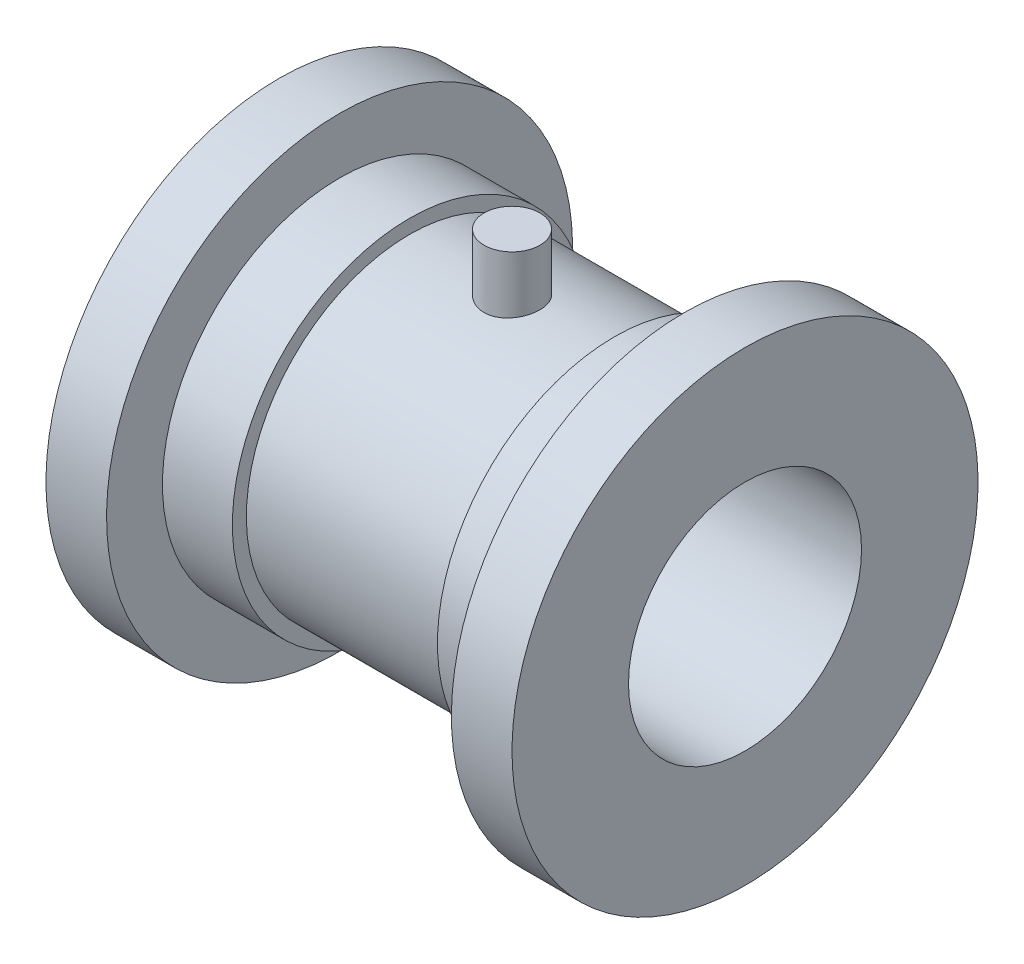
ISO-10303-21;
HEADER;
FILE_DESCRIPTION(('STEP AP214'),'2;1');
FILE_NAME('part.step','',(''),(''),'','','');
FILE_SCHEMA(('AUTOMOTIVE_DESIGN { 1 0 10303 214 1 1 1 1 }'));
ENDSEC;
DATA;
#1=APPLICATION_CONTEXT('core data for automotive mechanical design processes');
#2=APPLICATION_PROTOCOL_DEFINITION('international standard','automotive_design',2000,#1);
#3=PRODUCT_CONTEXT('',#1,'mechanical');
#4=PRODUCT('Part','Part','',(#3));
#5=PRODUCT_RELATED_PRODUCT_CATEGORY('part','',(#4));
#6=PRODUCT_DEFINITION_FORMATION('','',#4);
#7=PRODUCT_DEFINITION_CONTEXT('part definition',#1,'design');
#8=PRODUCT_DEFINITION('design','',#6,#7);
#9=PRODUCT_DEFINITION_SHAPE('','',#8);
#10=(LENGTH_UNIT() NAMED_UNIT(*) SI_UNIT(.MILLI.,.METRE.));
#11=(NAMED_UNIT(*) PLANE_ANGLE_UNIT() SI_UNIT($,.RADIAN.));
#12=(NAMED_UNIT(*) SI_UNIT($,.STERADIAN.) SOLID_ANGLE_UNIT());
#13=UNCERTAINTY_MEASURE_WITH_UNIT(LENGTH_MEASURE(1.E-05),#10,'distance_accuracy_value','');
#14=(GEOMETRIC_REPRESENTATION_CONTEXT(3) GLOBAL_UNCERTAINTY_ASSIGNED_CONTEXT((#13)) GLOBAL_UNIT_ASSIGNED_CONTEXT((#10,
#11,#12)) REPRESENTATION_CONTEXT('',''));
#15=CARTESIAN_POINT('',(0.,0.,0.));
#16=DIRECTION('',(0.,0.,1.));
#17=DIRECTION('',(1.,0.,0.));
#18=AXIS2_PLACEMENT_3D('',#15,#16,#17);
#19=CARTESIAN_POINT('',(25.,0.,0.));
#20=DIRECTION('',(1.,0.,0.));
#21=DIRECTION('',(0.,1.,0.));
#22=AXIS2_PLACEMENT_3D('',#19,#20,#21);
#23=CYLINDRICAL_SURFACE('',#22,17.5);
#24=CARTESIAN_POINT('',(0.,-17.3853386507137,2.));
#25=CARTESIAN_POINT('',(0.111946589372524,-17.3853401353315,1.99999519733595));
#26=CARTESIAN_POINT('',(0.223964994921923,-17.3864315751054,1.99056928251642));
#27=CARTESIAN_POINT('',(0.444889671697474,-17.3906782331753,1.95311344773096));
#28=CARTESIAN_POINT('',(0.553792479503965,-17.3938356616542,1.92506360351944));
#29=CARTESIAN_POINT('',(0.765255030279527,-17.4018520931882,1.85119296589626));
#30=CARTESIAN_POINT('',(0.867818819285594,-17.4067099973959,1.80538364660709));
#31=CARTESIAN_POINT('',(1.06378206604588,-17.4175786814491,1.6973178849601));
#32=CARTESIAN_POINT('',(1.15718320126785,-17.423589249671,1.6350644608687));
#33=CARTESIAN_POINT('',(1.33262956371172,-17.4361176819346,1.49556368835386));
#34=CARTESIAN_POINT('',(1.41462552791579,-17.4426375676046,1.41825455823809));
#35=CARTESIAN_POINT('',(1.56450902249383,-17.4554317583341,1.25096954824277));
#36=CARTESIAN_POINT('',(1.63239587710581,-17.4617060516193,1.16099306200071));
#37=CARTESIAN_POINT('',(1.75230824059131,-17.4733225280882,0.970620910263634));
#38=CARTESIAN_POINT('',(1.80428955803743,-17.4786620969871,0.870197236204717));
#39=CARTESIAN_POINT('',(1.89063240605875,-17.4877853680334,0.66197497320992));
#40=CARTESIAN_POINT('',(1.9249944880326,-17.4915691188697,0.554176615186415));
#41=CARTESIAN_POINT('',(1.97497734252851,-17.4971402074226,0.334766558288024));
#42=CARTESIAN_POINT('',(1.99067964857446,-17.4989362281041,0.223173657194599));
#43=CARTESIAN_POINT('',(2.00314972142082,-17.5003590938998,-0.00107691382555875));
#44=CARTESIAN_POINT('',(1.99991811760643,-17.4999860111176,-0.11373454823503));
#45=CARTESIAN_POINT('',(1.9746778272773,-17.497119767547,-0.33636248784968));
#46=CARTESIAN_POINT('',(1.95275682041612,-17.4946365066491,-0.44634287900327));
#47=CARTESIAN_POINT('',(1.89089682950376,-17.487840154992,-0.661053445479786));
#48=CARTESIAN_POINT('',(1.85095755129325,-17.4835270343592,-0.765783535057301));
#49=CARTESIAN_POINT('',(1.75410019097594,-17.4735386514763,-0.967294288035754));
#50=CARTESIAN_POINT('',(1.69714377600709,-17.4678603196472,-1.06405636819045));
#51=CARTESIAN_POINT('',(1.56789678444337,-17.4557776619181,-1.24668163917683));
#52=CARTESIAN_POINT('',(1.49560561983236,-17.449373308183,-1.33254441186903));
#53=CARTESIAN_POINT('',(1.33724919448781,-17.436513040988,-1.49144815236604));
#54=CARTESIAN_POINT('',(1.25110758210007,-17.4300570420279,-1.56441304576845));
#55=CARTESIAN_POINT('',(1.0677588923309,-17.4178574111694,-1.69485961446738));
#56=CARTESIAN_POINT('',(0.970551789715113,-17.4121137808956,-1.75234125445402));
#57=CARTESIAN_POINT('',(0.767767939743451,-17.4019890438088,-1.85019181534949));
#58=CARTESIAN_POINT('',(0.662188535919723,-17.3976083716403,-1.89055527879404));
#59=CARTESIAN_POINT('',(0.445689423466889,-17.3907142897617,-1.95295957446188));
#60=CARTESIAN_POINT('',(0.334769928945009,-17.3882008052541,-1.97500114064275));
#61=CARTESIAN_POINT('',(0.111409276007053,-17.3853390699854,-2.00003653434785));
#62=CARTESIAN_POINT('',(-0.00101976549901278,-17.384978682311,-2.00313713351255));
#63=CARTESIAN_POINT('',(-0.224795725911943,-17.3864318824203,-1.99048370024868));
#64=CARTESIAN_POINT('',(-0.336142663982754,-17.3882454316329,-1.97473000234356));
#65=CARTESIAN_POINT('',(-0.554277710431836,-17.3938311078367,-1.92490480743124));
#66=CARTESIAN_POINT('',(-0.661077653557208,-17.3975977651037,-1.89088445720912));
#67=CARTESIAN_POINT('',(-0.867456208856068,-17.4066608217964,-1.8055441206904));
#68=CARTESIAN_POINT('',(-0.96703460698983,-17.4119572665405,-1.75422362188829));
#69=CARTESIAN_POINT('',(-1.15662812006314,-17.4235123453982,-1.63547501760195));
#70=CARTESIAN_POINT('',(-1.24659891285623,-17.4297751382952,-1.56797655870491));
#71=CARTESIAN_POINT('',(-1.41397230825862,-17.442543959092,-1.41888814821184));
#72=CARTESIAN_POINT('',(-1.49137450327603,-17.4490499948718,-1.33729773979956));
#73=CARTESIAN_POINT('',(-1.63178548317454,-17.4616092377758,-1.16187651855541));
#74=CARTESIAN_POINT('',(-1.69472433770165,-17.4676601534551,-1.06798954470542));
#75=CARTESIAN_POINT('',(-1.80393937919363,-17.4785935486018,-0.870915351390362));
#76=CARTESIAN_POINT('',(-1.8502158540187,-17.4834760482544,-0.76772829263257));
#77=CARTESIAN_POINT('',(-1.92467566123988,-17.4915122431867,-0.55522073005071));
#78=CARTESIAN_POINT('',(-1.95290023506191,-17.4946698766728,-0.445914831710694));
#79=CARTESIAN_POINT('',(-1.99058941951927,-17.498916830849,-0.224077216219369));
#80=CARTESIAN_POINT('',(-2.00005473054384,-17.5000062287579,-0.111545619660739));
#81=CARTESIAN_POINT('',(-1.99994510250234,-17.4999937520126,0.112864401253133));
#82=CARTESIAN_POINT('',(-1.99047832045056,-17.4989043247502,0.224742894695049));
#83=CARTESIAN_POINT('',(-1.95300127134245,-17.4946812487719,0.445308378800854));
#84=CARTESIAN_POINT('',(-1.92499100344009,-17.4915475999627,0.553995369319134));
#85=CARTESIAN_POINT('',(-1.85125428527817,-17.4835868311737,0.765084431079245));
#86=CARTESIAN_POINT('',(-1.80553211653411,-17.478760120486,0.867488014290726));
#87=CARTESIAN_POINT('',(-1.69768073352085,-17.4679493137143,1.0631853726956));
#88=CARTESIAN_POINT('',(-1.63555145524283,-17.4619652131149,1.15647911234695));
#89=CARTESIAN_POINT('',(-1.49624648821104,-17.4494678477128,1.33186210611053));
#90=CARTESIAN_POINT('',(-1.41899021819487,-17.4429518630308,1.41388716420689));
#91=CARTESIAN_POINT('',(-1.25178901681435,-17.4301475365176,1.5638533009412));
#92=CARTESIAN_POINT('',(-1.16184106815131,-17.4238592492669,1.63179102096622));
#93=CARTESIAN_POINT('',(-0.971480376349264,-17.4122005213082,1.75183717616198));
#94=CARTESIAN_POINT('',(-0.871034600637649,-17.4068331273112,1.80389349456594));
#95=CARTESIAN_POINT('',(-0.662825662631923,-17.3976597913728,1.89032803888977));
#96=CARTESIAN_POINT('',(-0.555070743865214,-17.3938521233529,1.92472581745879));
#97=CARTESIAN_POINT('',(-0.372277873121076,-17.3891702575432,1.96647476380521));
#98=CARTESIAN_POINT('',(-0.298400454831266,-17.3877403947785,1.9790290620281));
#99=CARTESIAN_POINT('',(-0.149692726088288,-17.3858240977585,1.99579326119775));
#100=CARTESIAN_POINT('',(-0.0748624212969904,-17.3853376579002,2.00000321170177));
#101=CARTESIAN_POINT('',(0.,-17.3853386507137,2.));
#102=B_SPLINE_CURVE_WITH_KNOTS('',3,(#24,#25,#26,#27,#28,#29,#30,#31,#32,#33,#34,#35,#36,#37,
#38,#39,#40,#41,#42,#43,#44,#45,#46,#47,#48,#49,#50,#51,#52,#53,#54,#55,#56,#57,#58,#59,#60,#61,
#62,#63,#64,#65,#66,#67,#68,#69,#70,#71,#72,#73,#74,#75,#76,#77,#78,#79,#80,#81,#82,#83,#84,#85,
#86,#87,#88,#89,#90,#91,#92,#93,#94,#95,#96,#97,#98,#99,#100,#101),.UNSPECIFIED.,.T.,.F.,(4,2,2,
2,2,2,2,2,2,2,2,2,2,2,2,2,2,2,2,2,2,2,2,2,2,2,2,2,2,2,2,2,2,2,2,2,2,2,4),(0.,0.335566330669862,
0.671492236482426,1.00720146648589,1.34284912082551,1.67990430025881,2.01697561937898,
2.35497511648652,2.69296403516427,3.02947062308711,3.36596602520247,3.70089142156129,
4.03582228598058,4.3715133792636,4.70721734706225,5.04483970261994,5.3824628281258,
5.72019351085555,6.05791066376697,6.39372230997641,6.72952799811684,7.06439829362762,
7.3992785103225,7.73564232927687,8.07201705412561,8.40998545131677,8.74794800946722,
9.08513567305446,9.42231074728433,9.75756507912587,10.0928194262631,10.4279927825517,
10.7631674464669,11.1001786972192,11.4372702038874,11.7754563049136,12.113267132881,
12.3376728727777,12.5620772799195),.UNSPECIFIED.);
#103=CARTESIAN_POINT('',(0.,-17.3853386507137,2.));
#104=VERTEX_POINT('',#103);
#105=EDGE_CURVE('E60',#104,#104,#102,.T.);
#106=ORIENTED_EDGE('',*,*,#105,.T.);
#107=EDGE_LOOP('',(#106));
#108=FACE_BOUND('',#107,.T.);
#109=CARTESIAN_POINT('',(11.,0.,0.));
#110=DIRECTION('',(1.,0.,0.));
#111=DIRECTION('',(0.,1.,0.));
#112=AXIS2_PLACEMENT_3D('',#109,#110,#111);
#113=CIRCLE('',#112,17.5);
#114=CARTESIAN_POINT('',(11.,17.5,0.));
#115=VERTEX_POINT('',#114);
#116=EDGE_CURVE('E119',#115,#115,#113,.T.);
#117=ORIENTED_EDGE('',*,*,#116,.F.);
#118=EDGE_LOOP('',(#117));
#119=FACE_BOUND('',#118,.T.);
#120=CARTESIAN_POINT('',(-11.,0.,0.));
#121=DIRECTION('',(1.,0.,0.));
#122=DIRECTION('',(0.,1.,0.));
#123=AXIS2_PLACEMENT_3D('',#120,#121,#122);
#124=CIRCLE('',#123,17.5);
#125=CARTESIAN_POINT('',(-11.,17.5,0.));
#126=VERTEX_POINT('',#125);
#127=EDGE_CURVE('E122',#126,#126,#124,.T.);
#128=ORIENTED_EDGE('',*,*,#127,.T.);
#129=EDGE_LOOP('',(#128));
#130=FACE_BOUND('',#129,.T.);
#131=CARTESIAN_POINT('',(-3.,17.5,0.));
#132=CARTESIAN_POINT('',(-2.99999336002777,17.4999970906634,0.167197888477242));
#133=CARTESIAN_POINT('',(-2.9859752108854,17.4975789341583,0.334485258143131));
#134=CARTESIAN_POINT('',(-2.9302990995645,17.4881653307871,0.664363255770978));
#135=CARTESIAN_POINT('',(-2.88861617722034,17.4811657504724,0.826949503842277));
#136=CARTESIAN_POINT('',(-2.77891008604766,17.4633739362553,1.14260529013332));
#137=CARTESIAN_POINT('',(-2.7109089574683,17.4525848765595,1.29568266742598));
#138=CARTESIAN_POINT('',(-2.55055555976633,17.4283986081642,1.58823673724716));
#139=CARTESIAN_POINT('',(-2.45820589610098,17.4150016785645,1.72771488279892));
#140=CARTESIAN_POINT('',(-2.25078614716181,17.3869322580543,1.99053687981522));
#141=CARTESIAN_POINT('',(-2.13551837087062,17.3722493384791,2.11372361591322));
#142=CARTESIAN_POINT('',(-1.88595990137048,17.3433420797551,2.33910834882426));
#143=CARTESIAN_POINT('',(-1.75166797362762,17.3291177704403,2.44130498247174));
#144=CARTESIAN_POINT('',(-1.46678711062376,17.3026372057527,2.62244343427673));
#145=CARTESIAN_POINT('',(-1.31609740156248,17.2903944202576,2.70122890432628));
#146=CARTESIAN_POINT('',(-1.00337737292835,17.2694082884627,2.8323085511595));
#147=CARTESIAN_POINT('',(-0.841347866082793,17.2606646916761,2.88460462423909));
#148=CARTESIAN_POINT('',(-0.512216683497004,17.2477710031912,2.96072391561323));
#149=CARTESIAN_POINT('',(-0.34517963415869,17.243577079757,2.98481900474365));
#150=CARTESIAN_POINT('',(-0.00938486508187419,17.2401251006059,3.00469550116558));
#151=CARTESIAN_POINT('',(0.159372724883305,17.2408666753347,3.00047902833606));
#152=CARTESIAN_POINT('',(0.491871139844602,17.247161908727,2.9640733197104));
#153=CARTESIAN_POINT('',(0.655646636178515,17.2526628874287,2.93219030257035));
#154=CARTESIAN_POINT('',(0.975488916428065,17.2677745842644,2.84183747786595));
#155=CARTESIAN_POINT('',(1.13155542179294,17.277385450781,2.78336671037819));
#156=CARTESIAN_POINT('',(1.43246174324675,17.2996905267923,2.64119011069865));
#157=CARTESIAN_POINT('',(1.57724065502486,17.3124001155707,2.55735789103785));
#158=CARTESIAN_POINT('',(1.85079247024585,17.3394600238194,2.36692773155713));
#159=CARTESIAN_POINT('',(1.97956400729042,17.3538104831548,2.26032785038532));
#160=CARTESIAN_POINT('',(2.21921755595085,17.3827662542506,2.02572372299599));
#161=CARTESIAN_POINT('',(2.32984259754192,17.3973724389321,1.89745691927206));
#162=CARTESIAN_POINT('',(2.52803945123166,17.425020040751,1.62404588495938));
#163=CARTESIAN_POINT('',(2.61561109837572,17.4380614466915,1.47890153361697));
#164=CARTESIAN_POINT('',(2.76524184909041,17.4611302114515,1.17560813403869));
#165=CARTESIAN_POINT('',(2.82727737360573,17.4711547823576,1.01744722776392));
#166=CARTESIAN_POINT('',(2.9238318026769,17.4870382024854,0.692740844795709));
#167=CARTESIAN_POINT('',(2.95835314430384,17.4928974206486,0.526196112090002));
#168=CARTESIAN_POINT('',(2.99854888489858,17.4997401167391,0.191663620946767));
#169=CARTESIAN_POINT('',(3.00457589999581,17.5007831904569,0.0237194081687685));
#170=CARTESIAN_POINT('',(2.98855325145464,17.4980396044024,-0.310778590563214));
#171=CARTESIAN_POINT('',(2.96650473300188,17.4942531416242,-0.477332432950726));
#172=CARTESIAN_POINT('',(2.8952501678744,17.4823128742762,-0.803226267811299));
#173=CARTESIAN_POINT('',(2.84621953805802,17.474187289333,-0.962605737440311));
#174=CARTESIAN_POINT('',(2.72258016702585,17.4544761572207,-1.27088253097933));
#175=CARTESIAN_POINT('',(2.64796992113086,17.4428904065181,-1.41977923763672));
#176=CARTESIAN_POINT('',(2.47448758312578,17.417396034143,-1.70438969290455));
#177=CARTESIAN_POINT('',(2.37539627431762,17.4034668086373,-1.83996793782046));
#178=CARTESIAN_POINT('',(2.1560651176756,17.374890575826,-2.09269752640408));
#179=CARTESIAN_POINT('',(2.0358236388444,17.3602435132271,-2.20984744764914));
#180=CARTESIAN_POINT('',(1.77602051143289,17.3316886120672,-2.42370922919042));
#181=CARTESIAN_POINT('',(1.63626104120146,17.3177906676551,-2.52018230406535));
#182=CARTESIAN_POINT('',(1.34231277339394,17.2924954044816,-2.68828177195729));
#183=CARTESIAN_POINT('',(1.1881244522279,17.2810980031992,-2.75990898496466));
#184=CARTESIAN_POINT('',(0.870349519704499,17.2621692769636,-2.87593039066209));
#185=CARTESIAN_POINT('',(0.70680658082189,17.2546213950509,-2.92044137511779));
#186=CARTESIAN_POINT('',(0.374424534192306,17.2442055530579,-2.98133287310577));
#187=CARTESIAN_POINT('',(0.205585917790712,17.2413371601052,-2.99771598859209));
#188=CARTESIAN_POINT('',(-0.130208811389109,17.2406244562009,-3.00181092557774));
#189=CARTESIAN_POINT('',(-0.297160317320667,17.2427142552452,-2.98989876393497));
#190=CARTESIAN_POINT('',(-0.626645516275729,17.2515376902196,-2.93855658141656));
#191=CARTESIAN_POINT('',(-0.789179226060544,17.2582713085282,-2.89912666495964));
#192=CARTESIAN_POINT('',(-1.10505721850843,17.2755980335454,-2.79401555437729));
#193=CARTESIAN_POINT('',(-1.25841317801404,17.2861861092089,-2.72836856938937));
#194=CARTESIAN_POINT('',(-1.55199555431465,17.3100332980519,-2.57272591738777));
#195=CARTESIAN_POINT('',(-1.6922212577946,17.323292556223,-2.4827289285662));
#196=CARTESIAN_POINT('',(-1.95745891026577,17.3511960758331,-2.27960652854412));
#197=CARTESIAN_POINT('',(-2.08225791456266,17.3658556265499,-2.1662051126384));
#198=CARTESIAN_POINT('',(-2.31118326116821,17.3947877125717,-1.92007371238759));
#199=CARTESIAN_POINT('',(-2.41530483332687,17.4090601579197,-1.78733928025448));
#200=CARTESIAN_POINT('',(-2.6006229221308,17.4357318551825,-1.50514767837312));
#201=CARTESIAN_POINT('',(-2.68164531379999,17.4481165680147,-1.35557476659934));
#202=CARTESIAN_POINT('',(-2.81728768360264,17.4694759066054,-1.0447868677741));
#203=CARTESIAN_POINT('',(-2.8719336328885,17.4784538848809,-0.88358351302067));
#204=CARTESIAN_POINT('',(-2.94157686709655,17.4900568902174,-0.601487930679761));
#205=CARTESIAN_POINT('',(-2.96344994889187,17.4937653830011,-0.48229049681016));
#206=CARTESIAN_POINT('',(-2.99266378225941,17.4987379681287,-0.242077656560213));
#207=CARTESIAN_POINT('',(-3.00000480777727,17.5000021065514,-0.121062284493384));
#208=CARTESIAN_POINT('',(-3.,17.5,0.));
#209=B_SPLINE_CURVE_WITH_KNOTS('',3,(#131,#132,#133,#134,#135,#136,#137,#138,#139,#140,#141,
#142,#143,#144,#145,#146,#147,#148,#149,#150,#151,#152,#153,#154,#155,#156,#157,#158,#159,#160,
#161,#162,#163,#164,#165,#166,#167,#168,#169,#170,#171,#172,#173,#174,#175,#176,#177,#178,#179,
#180,#181,#182,#183,#184,#185,#186,#187,#188,#189,#190,#191,#192,#193,#194,#195,#196,#197,#198,
#199,#200,#201,#202,#203,#204,#205,#206,#207,#208),.UNSPECIFIED.,.T.,.F.,(4,2,2,2,2,2,2,2,2,2,2,
2,2,2,2,2,2,2,2,2,2,2,2,2,2,2,2,2,2,2,2,2,2,2,2,2,2,2,4),(0.,0.501151101757202,1.00275497607122,
1.50393968673033,2.00507078900043,2.5107284354123,3.01641891050083,3.52541434956454,
4.03437334603057,4.53838423155781,5.04235737878726,5.54082259089734,6.03930580101093,
6.54031528278254,7.04136750167458,7.54899572691696,8.05662758430693,8.56472712329612,
9.07278165232261,9.57453227491966,10.076262432039,10.5747686152101,11.0733041272271,
11.5764767729204,12.0796882378443,12.5884304724088,13.0971559153069,13.6036744532888,
14.1101461335088,14.6099250273454,15.1097020247342,15.6088290116353,16.1079830984257,
16.6133996019155,17.1189325666264,17.6281812174477,18.1369274164456,18.4998006653088,
18.8626670735372),.UNSPECIFIED.);
#210=CARTESIAN_POINT('',(-3.,17.5,0.));
#211=VERTEX_POINT('',#210);
#212=EDGE_CURVE('E10',#211,#211,#209,.T.);
#213=ORIENTED_EDGE('',*,*,#212,.F.);
#214=EDGE_LOOP('',(#213));
#215=FACE_BOUND('',#214,.T.);
#216=ADVANCED_FACE('F35',(#108,#119,#130,#215),#23,.T.);
#217=CARTESIAN_POINT('',(25.,0.,0.));
#218=DIRECTION('',(1.,0.,0.));
#219=DIRECTION('',(0.,1.,0.));
#220=AXIS2_PLACEMENT_3D('',#217,#218,#219);
#221=CYLINDRICAL_SURFACE('',#220,12.5);
#222=CARTESIAN_POINT('',(-25.,0.,0.));
#223=DIRECTION('',(1.,0.,0.));
#224=DIRECTION('',(0.,1.,0.));
#225=AXIS2_PLACEMENT_3D('',#222,#223,#224);
#226=CIRCLE('',#225,12.5);
#227=CARTESIAN_POINT('',(-25.,12.5,0.));
#228=VERTEX_POINT('',#227);
#229=EDGE_CURVE('E167',#228,#228,#226,.T.);
#230=ORIENTED_EDGE('',*,*,#229,.F.);
#231=EDGE_LOOP('',(#230));
#232=FACE_BOUND('',#231,.T.);
#233=CARTESIAN_POINT('',(25.,0.,0.));
#234=DIRECTION('',(1.,0.,0.));
#235=DIRECTION('',(0.,1.,0.));
#236=AXIS2_PLACEMENT_3D('',#233,#234,#235);
#237=CIRCLE('',#236,12.5);
#238=CARTESIAN_POINT('',(25.,12.5,0.));
#239=VERTEX_POINT('',#238);
#240=EDGE_CURVE('E164',#239,#239,#237,.T.);
#241=ORIENTED_EDGE('',*,*,#240,.T.);
#242=EDGE_LOOP('',(#241));
#243=FACE_BOUND('',#242,.T.);
#244=CARTESIAN_POINT('',(0.,-12.3389626792531,2.));
#245=CARTESIAN_POINT('',(0.111566715369601,-12.3389646365747,1.99999546268269));
#246=CARTESIAN_POINT('',(0.223195940876381,-12.3404922170901,1.99063305520351));
#247=CARTESIAN_POINT('',(0.443326847344627,-12.3464325117521,1.95344445500885));
#248=CARTESIAN_POINT('',(0.551825474504615,-12.3508479497636,1.92560083019994));
#249=CARTESIAN_POINT('',(0.762477313101267,-12.3620513503607,1.85230972937127));
#250=CARTESIAN_POINT('',(0.864635571645263,-12.3688373965941,1.8068764692589));
#251=CARTESIAN_POINT('',(1.05986648038844,-12.3840151290006,1.6997304164843));
#252=CARTESIAN_POINT('',(1.15294024493589,-12.3924066178675,1.63801962395042));
#253=CARTESIAN_POINT('',(1.32821893279529,-12.409935008592,1.49947140236479));
#254=CARTESIAN_POINT('',(1.41032926550982,-12.4190774196954,1.42251498707585));
#255=CARTESIAN_POINT('',(1.56052945966013,-12.4370285016078,1.25591709815232));
#256=CARTESIAN_POINT('',(1.62861851530075,-12.4458371532121,1.16627489597169));
#257=CARTESIAN_POINT('',(1.7491959612917,-12.4621862608068,0.976239917029318));
#258=CARTESIAN_POINT('',(1.80159669033811,-12.4697194921289,0.875790844473845));
#259=CARTESIAN_POINT('',(1.88874693905998,-12.4826077762261,0.667375995890959));
#260=CARTESIAN_POINT('',(1.92349751749068,-12.4879629596488,0.559410671172466));
#261=CARTESIAN_POINT('',(1.97407274436243,-12.4958528816707,0.340004128946068));
#262=CARTESIAN_POINT('',(1.99005611940511,-12.49841126176,0.228600363359408));
#263=CARTESIAN_POINT('',(2.00313650808571,-12.500500461766,0.00466480752225232));
#264=CARTESIAN_POINT('',(2.00023470914493,-12.5000314720312,-0.10786691136301));
#265=CARTESIAN_POINT('',(1.97575151431498,-12.4961375614702,-0.329779715978531));
#266=CARTESIAN_POINT('',(1.95434091575268,-12.4927396690852,-0.439180187321414));
#267=CARTESIAN_POINT('',(1.89371648537535,-12.4833998597574,-0.652815342747673));
#268=CARTESIAN_POINT('',(1.85450214519059,-12.4774578701704,-0.757049879228181));
#269=CARTESIAN_POINT('',(1.75921154129989,-12.4636513003451,-0.957905986409038));
#270=CARTESIAN_POINT('',(1.70306427260419,-12.4557786507463,-1.05449329349384));
#271=CARTESIAN_POINT('',(1.57555357138301,-12.4389865614945,-1.23693967157033));
#272=CARTESIAN_POINT('',(1.50418900182922,-12.4300670436423,-1.32279794013346));
#273=CARTESIAN_POINT('',(1.34732043643976,-12.4120565702159,-1.48235721573536));
#274=CARTESIAN_POINT('',(1.2616672241591,-12.4029648129688,-1.555911508216));
#275=CARTESIAN_POINT('',(1.07915724372807,-12.3857313850728,-1.68762680827441));
#276=CARTESIAN_POINT('',(0.982300387310595,-12.3775897219101,-1.74578769456446));
#277=CARTESIAN_POINT('',(0.779969490042988,-12.3631781549851,-1.84509031627292));
#278=CARTESIAN_POINT('',(0.674487164843649,-12.3569100782548,-1.88621545421918));
#279=CARTESIAN_POINT('',(0.457989378356676,-12.3469864391895,-1.95012354011945));
#280=CARTESIAN_POINT('',(0.346974364635672,-12.343330665898,-1.9729079691951));
#281=CARTESIAN_POINT('',(0.123872177326534,-12.3390860491727,-1.99928349997629));
#282=CARTESIAN_POINT('',(0.0118102853156303,-12.338463865144,-2.0030832637492));
#283=CARTESIAN_POINT('',(-0.211348966265646,-12.3402681873056,-1.99193667548245));
#284=CARTESIAN_POINT('',(-0.322446359912493,-12.3426945853421,-1.97699098847046));
#285=CARTESIAN_POINT('',(-0.539866905444395,-12.3502919469979,-1.92895527704861));
#286=CARTESIAN_POINT('',(-0.646213923180768,-12.3554469800096,-1.89597053344241));
#287=CARTESIAN_POINT('',(-0.85187038701668,-12.3679074973821,-1.81290306911356));
#288=CARTESIAN_POINT('',(-0.951179441681864,-12.3752131012361,-1.76281939829005));
#289=CARTESIAN_POINT('',(-1.14087239308146,-12.3912295180301,-1.64647965217412));
#290=CARTESIAN_POINT('',(-1.23117295357006,-12.3999517832886,-1.58008930093855));
#291=CARTESIAN_POINT('',(-1.39942606063674,-12.4177848415153,-1.43320604247695));
#292=CARTESIAN_POINT('',(-1.47737780864004,-12.426895659562,-1.35271222391417));
#293=CARTESIAN_POINT('',(-1.61947729209286,-12.4445842082074,-1.17898475488122));
#294=CARTESIAN_POINT('',(-1.68348622911078,-12.4531560233311,-1.08563688229299));
#295=CARTESIAN_POINT('',(-1.7949130459885,-12.4687070996718,-0.889391847388558));
#296=CARTESIAN_POINT('',(-1.8423314293228,-12.4756864092145,-0.786494974976326));
#297=CARTESIAN_POINT('',(-1.91901272401869,-12.4872402999743,-0.57449377709434));
#298=CARTESIAN_POINT('',(-1.94834960623599,-12.4918246669271,-0.465416763098579));
#299=CARTESIAN_POINT('',(-1.98827383639251,-12.4981133908354,-0.243805255219827));
#300=CARTESIAN_POINT('',(-1.99886260115402,-12.4998179654206,-0.131271023257731));
#301=CARTESIAN_POINT('',(-2.00095179807928,-12.5001523384762,0.0927181607457113));
#302=CARTESIAN_POINT('',(-1.99266389940292,-12.4988162330541,0.204171144782975));
#303=CARTESIAN_POINT('',(-1.95769116172815,-12.4932886224694,0.424076331137223));
#304=CARTESIAN_POINT('',(-1.93100640664942,-12.4890971303321,0.532528547140255));
#305=CARTESIAN_POINT('',(-1.86007617517217,-12.4783277894448,0.743282123112945));
#306=CARTESIAN_POINT('',(-1.81584732795194,-12.471752200968,0.845589202324673));
#307=CARTESIAN_POINT('',(-1.71110753962108,-12.4569342995937,1.0413631983055));
#308=CARTESIAN_POINT('',(-1.65059592553781,-12.4486919178104,1.13482974947654));
#309=CARTESIAN_POINT('',(-1.51425167961562,-12.4313454639236,1.31133889146831));
#310=CARTESIAN_POINT('',(-1.4382634970135,-12.4222331866072,1.39426053318836));
#311=CARTESIAN_POINT('',(-1.27345013113633,-12.4042323453373,1.54625119082762));
#312=CARTESIAN_POINT('',(-1.18462194427879,-12.3953438343009,1.61531695647598));
#313=CARTESIAN_POINT('',(-0.995970826081013,-12.3787350502446,1.73804191736152));
#314=CARTESIAN_POINT('',(-0.896080549743534,-12.3710226983478,1.79159866107389));
#315=CARTESIAN_POINT('',(-0.688641710336669,-12.35773272045,1.88109182389773));
#316=CARTESIAN_POINT('',(-0.581101048458822,-12.3521529288763,1.91704612842095));
#317=CARTESIAN_POINT('',(-0.394262041879368,-12.3450187006154,1.96235985662764));
#318=CARTESIAN_POINT('',(-0.316104706528516,-12.3427600761638,1.97645270113688));
#319=CARTESIAN_POINT('',(-0.158642105439383,-12.339731381368,1.99527431170452));
#320=CARTESIAN_POINT('',(-0.079336857961894,-12.3389612873707,2.00000322655819));
#321=CARTESIAN_POINT('',(0.,-12.3389626792531,2.));
#322=B_SPLINE_CURVE_WITH_KNOTS('',3,(#244,#245,#246,#247,#248,#249,#250,#251,#252,#253,#254,
#255,#256,#257,#258,#259,#260,#261,#262,#263,#264,#265,#266,#267,#268,#269,#270,#271,#272,#273,
#274,#275,#276,#277,#278,#279,#280,#281,#282,#283,#284,#285,#286,#287,#288,#289,#290,#291,#292,
#293,#294,#295,#296,#297,#298,#299,#300,#301,#302,#303,#304,#305,#306,#307,#308,#309,#310,#311,
#312,#313,#314,#315,#316,#317,#318,#319,#320,#321),.UNSPECIFIED.,.T.,.F.,(4,2,2,2,2,2,2,2,2,2,2,
2,2,2,2,2,2,2,2,2,2,2,2,2,2,2,2,2,2,2,2,2,2,2,2,2,2,2,4),(0.,0.334410082462096,0.66913604063283,
1.00359203680449,1.33800695527949,1.6751426933581,2.01229780104021,2.35130309503299,
2.69028805118043,3.02638485112864,3.36246051891023,3.69546762348862,4.0284842373816,
4.36291718178071,4.69737512358616,5.03557384337791,5.37377522782555,5.71230534220323,
6.05080811551122,6.3855820633356,6.72034413480418,7.05317297710996,7.38602031604106,
7.7217061792982,8.05741374188326,8.39632425403564,8.73522448035856,9.07272891067331,
9.41020783420237,9.74392117047707,10.0776329844847,10.4110292424998,10.7444392820194,
11.0813822106389,11.4184040861632,11.7576040091322,12.0964585602663,12.3342666441618,
12.5720709491951),.UNSPECIFIED.);
#323=CARTESIAN_POINT('',(0.,-12.3389626792531,2.));
#324=VERTEX_POINT('',#323);
#325=EDGE_CURVE('E39',#324,#324,#322,.T.);
#326=ORIENTED_EDGE('',*,*,#325,.F.);
#327=EDGE_LOOP('',(#326));
#328=FACE_BOUND('',#327,.T.);
#329=ADVANCED_FACE('F78',(#232,#243,#328),#221,.F.);
#330=CARTESIAN_POINT('',(25.,0.,0.));
#331=DIRECTION('',(-1.,0.,0.));
#332=DIRECTION('',(0.,-1.,0.));
#333=AXIS2_PLACEMENT_3D('',#330,#331,#332);
#334=PLANE('',#333);
#335=ORIENTED_EDGE('',*,*,#240,.F.);
#336=EDGE_LOOP('',(#335));
#337=FACE_BOUND('',#336,.T.);
#338=CARTESIAN_POINT('',(25.,0.,0.));
#339=DIRECTION('',(1.,0.,0.));
#340=DIRECTION('',(0.,1.,0.));
#341=AXIS2_PLACEMENT_3D('',#338,#339,#340);
#342=CIRCLE('',#341,25.);
#343=CARTESIAN_POINT('',(25.,25.,0.));
#344=VERTEX_POINT('',#343);
#345=EDGE_CURVE('E47',#344,#344,#342,.T.);
#346=ORIENTED_EDGE('',*,*,#345,.T.);
#347=EDGE_LOOP('',(#346));
#348=FACE_BOUND('',#347,.T.);
#349=ADVANCED_FACE('F37',(#337,#348),#334,.F.);
#350=CARTESIAN_POINT('',(25.,0.,0.));
#351=DIRECTION('',(1.,0.,0.));
#352=DIRECTION('',(0.,1.,0.));
#353=AXIS2_PLACEMENT_3D('',#350,#351,#352);
#354=CYLINDRICAL_SURFACE('',#353,25.);
#355=CARTESIAN_POINT('',(18.5,0.,0.));
#356=DIRECTION('',(1.,0.,0.));
#357=DIRECTION('',(0.,1.,0.));
#358=AXIS2_PLACEMENT_3D('',#355,#356,#357);
#359=CIRCLE('',#358,25.);
#360=CARTESIAN_POINT('',(18.5,25.,0.));
#361=VERTEX_POINT('',#360);
#362=EDGE_CURVE('E52',#361,#361,#359,.T.);
#363=ORIENTED_EDGE('',*,*,#362,.T.);
#364=EDGE_LOOP('',(#363));
#365=FACE_BOUND('',#364,.T.);
#366=ORIENTED_EDGE('',*,*,#345,.F.);
#367=EDGE_LOOP('',(#366));
#368=FACE_BOUND('',#367,.T.);
#369=ADVANCED_FACE('F140',(#365,#368),#354,.T.);
#370=CARTESIAN_POINT('',(18.5,0.,0.));
#371=DIRECTION('',(-1.,0.,0.));
#372=DIRECTION('',(0.,-1.,0.));
#373=AXIS2_PLACEMENT_3D('',#370,#371,#372);
#374=PLANE('',#373);
#375=CARTESIAN_POINT('',(18.5,0.,0.));
#376=DIRECTION('',(1.,0.,0.));
#377=DIRECTION('',(0.,1.,0.));
#378=AXIS2_PLACEMENT_3D('',#375,#376,#377);
#379=CIRCLE('',#378,19.);
#380=CARTESIAN_POINT('',(18.5,19.,0.));
#381=VERTEX_POINT('',#380);
#382=EDGE_CURVE('E134',#381,#381,#379,.T.);
#383=ORIENTED_EDGE('',*,*,#382,.T.);
#384=EDGE_LOOP('',(#383));
#385=FACE_BOUND('',#384,.T.);
#386=ORIENTED_EDGE('',*,*,#362,.F.);
#387=EDGE_LOOP('',(#386));
#388=FACE_BOUND('',#387,.T.);
#389=ADVANCED_FACE('F143',(#385,#388),#374,.T.);
#390=CARTESIAN_POINT('',(25.,0.,0.));
#391=DIRECTION('',(1.,0.,0.));
#392=DIRECTION('',(0.,1.,0.));
#393=AXIS2_PLACEMENT_3D('',#390,#391,#392);
#394=CYLINDRICAL_SURFACE('',#393,19.);
#395=CARTESIAN_POINT('',(11.,0.,0.));
#396=DIRECTION('',(1.,0.,0.));
#397=DIRECTION('',(0.,1.,0.));
#398=AXIS2_PLACEMENT_3D('',#395,#396,#397);
#399=CIRCLE('',#398,19.);
#400=CARTESIAN_POINT('',(11.,19.,0.));
#401=VERTEX_POINT('',#400);
#402=EDGE_CURVE('E125',#401,#401,#399,.T.);
#403=ORIENTED_EDGE('',*,*,#402,.T.);
#404=EDGE_LOOP('',(#403));
#405=FACE_BOUND('',#404,.T.);
#406=ORIENTED_EDGE('',*,*,#382,.F.);
#407=EDGE_LOOP('',(#406));
#408=FACE_BOUND('',#407,.T.);
#409=ADVANCED_FACE('F105',(#405,#408),#394,.T.);
#410=CARTESIAN_POINT('',(11.,0.,0.));
#411=DIRECTION('',(-1.,0.,0.));
#412=DIRECTION('',(0.,-1.,0.));
#413=AXIS2_PLACEMENT_3D('',#410,#411,#412);
#414=PLANE('',#413);
#415=ORIENTED_EDGE('',*,*,#116,.T.);
#416=EDGE_LOOP('',(#415));
#417=FACE_BOUND('',#416,.T.);
#418=ORIENTED_EDGE('',*,*,#402,.F.);
#419=EDGE_LOOP('',(#418));
#420=FACE_BOUND('',#419,.T.);
#421=ADVANCED_FACE('F100',(#417,#420),#414,.T.);
#422=CARTESIAN_POINT('',(-11.,0.,0.));
#423=DIRECTION('',(-1.,0.,0.));
#424=DIRECTION('',(0.,-1.,0.));
#425=AXIS2_PLACEMENT_3D('',#422,#423,#424);
#426=PLANE('',#425);
#427=ORIENTED_EDGE('',*,*,#127,.F.);
#428=EDGE_LOOP('',(#427));
#429=FACE_BOUND('',#428,.T.);
#430=CARTESIAN_POINT('',(-11.,0.,0.));
#431=DIRECTION('',(1.,0.,0.));
#432=DIRECTION('',(0.,1.,0.));
#433=AXIS2_PLACEMENT_3D('',#430,#431,#432);
#434=CIRCLE('',#433,19.);
#435=CARTESIAN_POINT('',(-11.,19.,0.));
#436=VERTEX_POINT('',#435);
#437=EDGE_CURVE('E123',#436,#436,#434,.T.);
#438=ORIENTED_EDGE('',*,*,#437,.T.);
#439=EDGE_LOOP('',(#438));
#440=FACE_BOUND('',#439,.T.);
#441=ADVANCED_FACE('F97',(#429,#440),#426,.F.);
#442=CARTESIAN_POINT('',(25.,0.,0.));
#443=DIRECTION('',(1.,0.,0.));
#444=DIRECTION('',(0.,1.,0.));
#445=AXIS2_PLACEMENT_3D('',#442,#443,#444);
#446=CYLINDRICAL_SURFACE('',#445,19.);
#447=ORIENTED_EDGE('',*,*,#437,.F.);
#448=EDGE_LOOP('',(#447));
#449=FACE_BOUND('',#448,.T.);
#450=CARTESIAN_POINT('',(-18.5,0.,0.));
#451=DIRECTION('',(1.,0.,0.));
#452=DIRECTION('',(0.,1.,0.));
#453=AXIS2_PLACEMENT_3D('',#450,#451,#452);
#454=CIRCLE('',#453,19.);
#455=CARTESIAN_POINT('',(-18.5,19.,0.));
#456=VERTEX_POINT('',#455);
#457=EDGE_CURVE('E128',#456,#456,#454,.T.);
#458=ORIENTED_EDGE('',*,*,#457,.T.);
#459=EDGE_LOOP('',(#458));
#460=FACE_BOUND('',#459,.T.);
#461=ADVANCED_FACE('F94',(#449,#460),#446,.T.);
#462=CARTESIAN_POINT('',(-18.5,0.,0.));
#463=DIRECTION('',(-1.,0.,0.));
#464=DIRECTION('',(0.,-1.,0.));
#465=AXIS2_PLACEMENT_3D('',#462,#463,#464);
#466=PLANE('',#465);
#467=ORIENTED_EDGE('',*,*,#457,.F.);
#468=EDGE_LOOP('',(#467));
#469=FACE_BOUND('',#468,.T.);
#470=CARTESIAN_POINT('',(-18.5,0.,0.));
#471=DIRECTION('',(1.,0.,0.));
#472=DIRECTION('',(0.,1.,0.));
#473=AXIS2_PLACEMENT_3D('',#470,#471,#472);
#474=CIRCLE('',#473,25.);
#475=CARTESIAN_POINT('',(-18.5,25.,0.));
#476=VERTEX_POINT('',#475);
#477=EDGE_CURVE('E174',#476,#476,#474,.T.);
#478=ORIENTED_EDGE('',*,*,#477,.T.);
#479=EDGE_LOOP('',(#478));
#480=FACE_BOUND('',#479,.T.);
#481=ADVANCED_FACE('F90',(#469,#480),#466,.F.);
#482=CARTESIAN_POINT('',(25.,0.,0.));
#483=DIRECTION('',(1.,0.,0.));
#484=DIRECTION('',(0.,1.,0.));
#485=AXIS2_PLACEMENT_3D('',#482,#483,#484);
#486=CYLINDRICAL_SURFACE('',#485,25.);
#487=ORIENTED_EDGE('',*,*,#477,.F.);
#488=EDGE_LOOP('',(#487));
#489=FACE_BOUND('',#488,.T.);
#490=CARTESIAN_POINT('',(-25.,0.,0.));
#491=DIRECTION('',(1.,0.,0.));
#492=DIRECTION('',(0.,1.,0.));
#493=AXIS2_PLACEMENT_3D('',#490,#491,#492);
#494=CIRCLE('',#493,25.);
#495=CARTESIAN_POINT('',(-25.,25.,0.));
#496=VERTEX_POINT('',#495);
#497=EDGE_CURVE('E169',#496,#496,#494,.T.);
#498=ORIENTED_EDGE('',*,*,#497,.T.);
#499=EDGE_LOOP('',(#498));
#500=FACE_BOUND('',#499,.T.);
#501=ADVANCED_FACE('F86',(#489,#500),#486,.T.);
#502=CARTESIAN_POINT('',(-25.,0.,0.));
#503=DIRECTION('',(-1.,0.,0.));
#504=DIRECTION('',(0.,-1.,0.));
#505=AXIS2_PLACEMENT_3D('',#502,#503,#504);
#506=PLANE('',#505);
#507=ORIENTED_EDGE('',*,*,#229,.T.);
#508=EDGE_LOOP('',(#507));
#509=FACE_BOUND('',#508,.T.);
#510=ORIENTED_EDGE('',*,*,#497,.F.);
#511=EDGE_LOOP('',(#510));
#512=FACE_BOUND('',#511,.T.);
#513=ADVANCED_FACE('F76',(#509,#512),#506,.T.);
#514=CARTESIAN_POINT('',(0.,-42.,0.));
#515=DIRECTION('',(0.,1.,0.));
#516=DIRECTION('',(0.,0.,1.));
#517=AXIS2_PLACEMENT_3D('',#514,#515,#516);
#518=CYLINDRICAL_SURFACE('',#517,2.);
#519=ORIENTED_EDGE('',*,*,#325,.T.);
#520=EDGE_LOOP('',(#519));
#521=FACE_BOUND('',#520,.T.);
#522=ORIENTED_EDGE('',*,*,#105,.F.);
#523=EDGE_LOOP('',(#522));
#524=FACE_BOUND('',#523,.T.);
#525=ADVANCED_FACE('F72',(#521,#524),#518,.F.);
#526=CARTESIAN_POINT('',(0.,23.5,0.));
#527=DIRECTION('',(0.,-1.,0.));
#528=DIRECTION('',(0.,0.,-1.));
#529=AXIS2_PLACEMENT_3D('',#526,#527,#528);
#530=CYLINDRICAL_SURFACE('',#529,3.);
#531=CARTESIAN_POINT('',(0.,23.5,0.));
#532=DIRECTION('',(0.,1.,0.));
#533=DIRECTION('',(0.,0.,1.));
#534=AXIS2_PLACEMENT_3D('',#531,#532,#533);
#535=CIRCLE('',#534,3.);
#536=CARTESIAN_POINT('',(0.,23.5,3.));
#537=VERTEX_POINT('',#536);
#538=EDGE_CURVE('E59',#537,#537,#535,.T.);
#539=ORIENTED_EDGE('',*,*,#538,.F.);
#540=EDGE_LOOP('',(#539));
#541=FACE_BOUND('',#540,.T.);
#542=ORIENTED_EDGE('',*,*,#212,.T.);
#543=EDGE_LOOP('',(#542));
#544=FACE_BOUND('',#543,.T.);
#545=ADVANCED_FACE('F67',(#541,#544),#530,.T.);
#546=CARTESIAN_POINT('',(0.,23.5,0.));
#547=DIRECTION('',(0.,1.,0.));
#548=DIRECTION('',(0.,0.,1.));
#549=AXIS2_PLACEMENT_3D('',#546,#547,#548);
#550=PLANE('',#549);
#551=ORIENTED_EDGE('',*,*,#538,.T.);
#552=EDGE_LOOP('',(#551));
#553=FACE_BOUND('',#552,.T.);
#554=ADVANCED_FACE('F71',(#553),#550,.T.);
#555=CLOSED_SHELL('',(#216,#329,#349,#369,#389,#409,#421,#441,#461,#481,#501,#513,#525,#545,#554));
#556=MANIFOLD_SOLID_BREP('B2',#555);
#557=ADVANCED_BREP_SHAPE_REPRESENTATION('',(#18,#556),#14);
#558=SHAPE_DEFINITION_REPRESENTATION(#9,#557);
ENDSEC;
END-ISO-10303-21;
